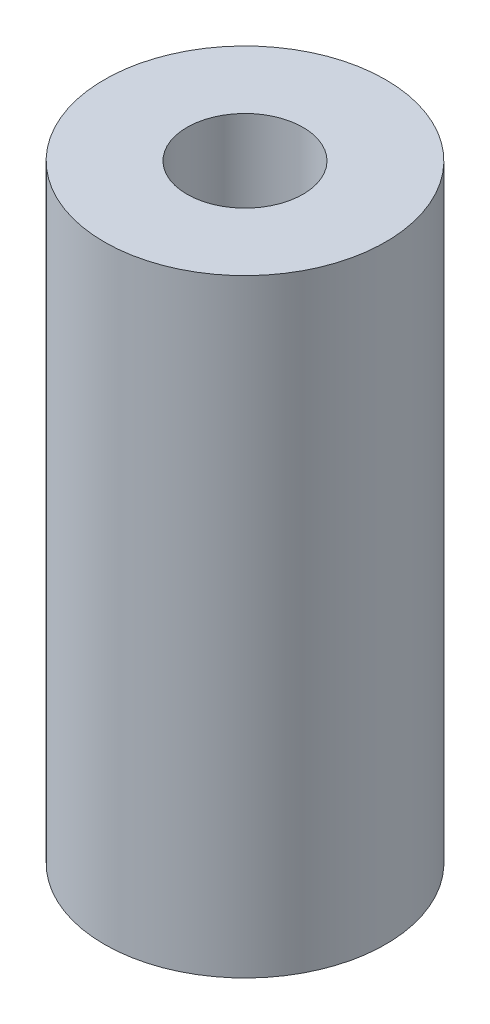
ISO-10303-21;
HEADER;
FILE_DESCRIPTION(('STEP AP214'),'2;1');
FILE_NAME('part.step','',(''),(''),'','','');
FILE_SCHEMA(('AUTOMOTIVE_DESIGN { 1 0 10303 214 1 1 1 1 }'));
ENDSEC;
DATA;
#1=APPLICATION_CONTEXT('core data for automotive mechanical design processes');
#2=APPLICATION_PROTOCOL_DEFINITION('international standard','automotive_design',2000,#1);
#3=PRODUCT_CONTEXT('',#1,'mechanical');
#4=PRODUCT('Part','Part','',(#3));
#5=PRODUCT_RELATED_PRODUCT_CATEGORY('part','',(#4));
#6=PRODUCT_DEFINITION_FORMATION('','',#4);
#7=PRODUCT_DEFINITION_CONTEXT('part definition',#1,'design');
#8=PRODUCT_DEFINITION('design','',#6,#7);
#9=PRODUCT_DEFINITION_SHAPE('','',#8);
#10=(LENGTH_UNIT() NAMED_UNIT(*) SI_UNIT(.MILLI.,.METRE.));
#11=(NAMED_UNIT(*) PLANE_ANGLE_UNIT() SI_UNIT($,.RADIAN.));
#12=(NAMED_UNIT(*) SI_UNIT($,.STERADIAN.) SOLID_ANGLE_UNIT());
#13=UNCERTAINTY_MEASURE_WITH_UNIT(LENGTH_MEASURE(1.E-05),#10,'distance_accuracy_value','');
#14=(GEOMETRIC_REPRESENTATION_CONTEXT(3) GLOBAL_UNCERTAINTY_ASSIGNED_CONTEXT((#13)) GLOBAL_UNIT_ASSIGNED_CONTEXT((#10,
#11,#12)) REPRESENTATION_CONTEXT('',''));
#15=CARTESIAN_POINT('',(0.,0.,0.));
#16=DIRECTION('',(0.,0.,1.));
#17=DIRECTION('',(1.,0.,0.));
#18=AXIS2_PLACEMENT_3D('',#15,#16,#17);
#19=CARTESIAN_POINT('',(0.,17.3,0.));
#20=DIRECTION('',(0.,1.,0.));
#21=DIRECTION('',(0.,0.,1.));
#22=AXIS2_PLACEMENT_3D('',#19,#20,#21);
#23=PLANE('',#22);
#24=CARTESIAN_POINT('',(0.,17.3,0.));
#25=DIRECTION('',(0.,1.,0.));
#26=DIRECTION('',(0.,0.,1.));
#27=AXIS2_PLACEMENT_3D('',#24,#25,#26);
#28=CIRCLE('',#27,4.);
#29=CARTESIAN_POINT('',(0.,17.3,4.));
#30=VERTEX_POINT('',#29);
#31=EDGE_CURVE('E10',#30,#30,#28,.T.);
#32=ORIENTED_EDGE('',*,*,#31,.T.);
#33=EDGE_LOOP('',(#32));
#34=FACE_BOUND('',#33,.T.);
#35=CARTESIAN_POINT('',(0.,17.3,0.));
#36=DIRECTION('',(0.,1.,0.));
#37=DIRECTION('',(0.,0.,1.));
#38=AXIS2_PLACEMENT_3D('',#35,#36,#37);
#39=CIRCLE('',#38,1.65);
#40=CARTESIAN_POINT('',(0.,17.3,1.65));
#41=VERTEX_POINT('',#40);
#42=EDGE_CURVE('E42',#41,#41,#39,.T.);
#43=ORIENTED_EDGE('',*,*,#42,.F.);
#44=EDGE_LOOP('',(#43));
#45=FACE_BOUND('',#44,.T.);
#46=ADVANCED_FACE('F31',(#34,#45),#23,.T.);
#47=CARTESIAN_POINT('',(0.,0.,0.));
#48=DIRECTION('',(0.,1.,0.));
#49=DIRECTION('',(0.,0.,1.));
#50=AXIS2_PLACEMENT_3D('',#47,#48,#49);
#51=PLANE('',#50);
#52=CARTESIAN_POINT('',(0.,0.,0.));
#53=DIRECTION('',(0.,1.,0.));
#54=DIRECTION('',(0.,0.,1.));
#55=AXIS2_PLACEMENT_3D('',#52,#53,#54);
#56=CIRCLE('',#55,4.);
#57=CARTESIAN_POINT('',(0.,0.,4.));
#58=VERTEX_POINT('',#57);
#59=EDGE_CURVE('E35',#58,#58,#56,.T.);
#60=ORIENTED_EDGE('',*,*,#59,.F.);
#61=EDGE_LOOP('',(#60));
#62=FACE_BOUND('',#61,.T.);
#63=CARTESIAN_POINT('',(0.,0.,0.));
#64=DIRECTION('',(0.,1.,0.));
#65=DIRECTION('',(0.,0.,1.));
#66=AXIS2_PLACEMENT_3D('',#63,#64,#65);
#67=CIRCLE('',#66,1.65);
#68=CARTESIAN_POINT('',(0.,0.,1.65));
#69=VERTEX_POINT('',#68);
#70=EDGE_CURVE('E44',#69,#69,#67,.T.);
#71=ORIENTED_EDGE('',*,*,#70,.T.);
#72=EDGE_LOOP('',(#71));
#73=FACE_BOUND('',#72,.T.);
#74=ADVANCED_FACE('F54',(#62,#73),#51,.F.);
#75=CARTESIAN_POINT('',(0.,17.3,0.));
#76=DIRECTION('',(0.,-1.,0.));
#77=DIRECTION('',(0.,0.,-1.));
#78=AXIS2_PLACEMENT_3D('',#75,#76,#77);
#79=CYLINDRICAL_SURFACE('',#78,4.);
#80=ORIENTED_EDGE('',*,*,#31,.F.);
#81=EDGE_LOOP('',(#80));
#82=FACE_BOUND('',#81,.T.);
#83=ORIENTED_EDGE('',*,*,#59,.T.);
#84=EDGE_LOOP('',(#83));
#85=FACE_BOUND('',#84,.T.);
#86=ADVANCED_FACE('F33',(#82,#85),#79,.T.);
#87=CARTESIAN_POINT('',(0.,17.3,0.));
#88=DIRECTION('',(0.,-1.,0.));
#89=DIRECTION('',(0.,0.,-1.));
#90=AXIS2_PLACEMENT_3D('',#87,#88,#89);
#91=CYLINDRICAL_SURFACE('',#90,1.65);
#92=ORIENTED_EDGE('',*,*,#42,.T.);
#93=EDGE_LOOP('',(#92));
#94=FACE_BOUND('',#93,.T.);
#95=ORIENTED_EDGE('',*,*,#70,.F.);
#96=EDGE_LOOP('',(#95));
#97=FACE_BOUND('',#96,.T.);
#98=ADVANCED_FACE('F50',(#94,#97),#91,.F.);
#99=CLOSED_SHELL('',(#46,#74,#86,#98));
#100=MANIFOLD_SOLID_BREP('B2',#99);
#101=ADVANCED_BREP_SHAPE_REPRESENTATION('',(#18,#100),#14);
#102=SHAPE_DEFINITION_REPRESENTATION(#9,#101);
ENDSEC;
END-ISO-10303-21;
